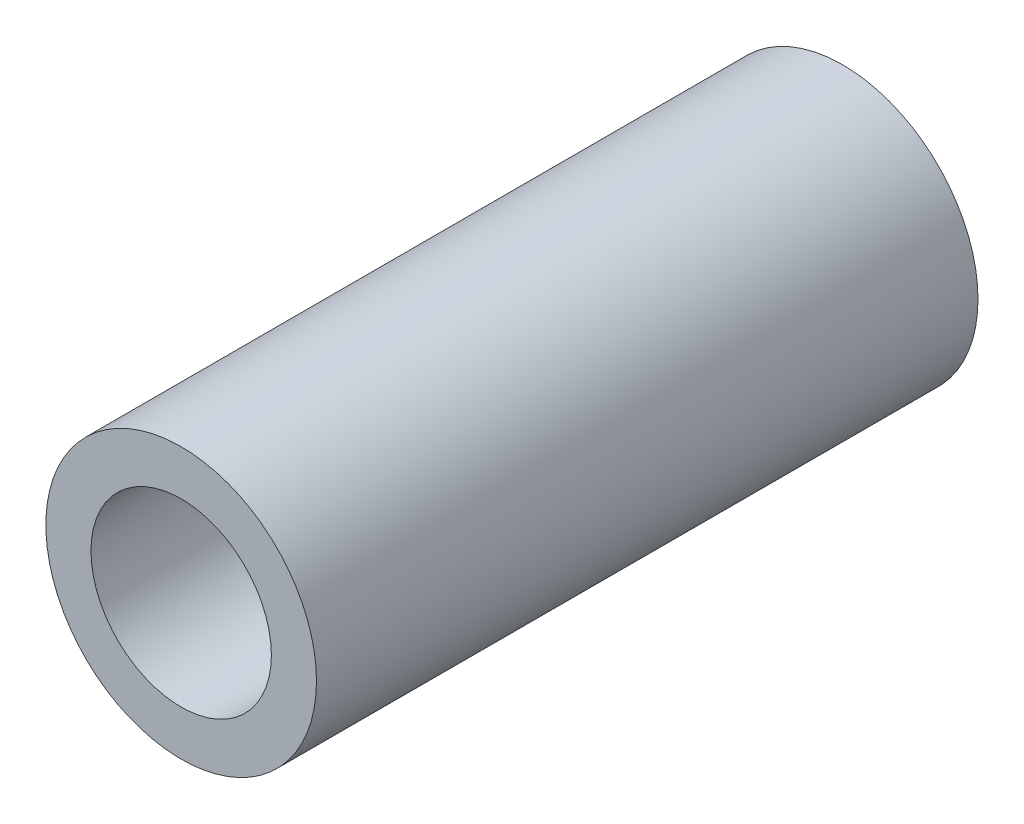
ISO-10303-21;
HEADER;
FILE_DESCRIPTION(('STEP AP214'),'2;1');
FILE_NAME('part.step','',(''),(''),'','','');
FILE_SCHEMA(('AUTOMOTIVE_DESIGN { 1 0 10303 214 1 1 1 1 }'));
ENDSEC;
DATA;
#1=APPLICATION_CONTEXT('core data for automotive mechanical design processes');
#2=APPLICATION_PROTOCOL_DEFINITION('international standard','automotive_design',2000,#1);
#3=PRODUCT_CONTEXT('',#1,'mechanical');
#4=PRODUCT('Part','Part','',(#3));
#5=PRODUCT_RELATED_PRODUCT_CATEGORY('part','',(#4));
#6=PRODUCT_DEFINITION_FORMATION('','',#4);
#7=PRODUCT_DEFINITION_CONTEXT('part definition',#1,'design');
#8=PRODUCT_DEFINITION('design','',#6,#7);
#9=PRODUCT_DEFINITION_SHAPE('','',#8);
#10=(LENGTH_UNIT() NAMED_UNIT(*) SI_UNIT(.MILLI.,.METRE.));
#11=(NAMED_UNIT(*) PLANE_ANGLE_UNIT() SI_UNIT($,.RADIAN.));
#12=(NAMED_UNIT(*) SI_UNIT($,.STERADIAN.) SOLID_ANGLE_UNIT());
#13=UNCERTAINTY_MEASURE_WITH_UNIT(LENGTH_MEASURE(1.E-05),#10,'distance_accuracy_value','');
#14=(GEOMETRIC_REPRESENTATION_CONTEXT(3) GLOBAL_UNCERTAINTY_ASSIGNED_CONTEXT((#13)) GLOBAL_UNIT_ASSIGNED_CONTEXT((#10,
#11,#12)) REPRESENTATION_CONTEXT('',''));
#15=CARTESIAN_POINT('',(0.,0.,0.));
#16=DIRECTION('',(0.,0.,1.));
#17=DIRECTION('',(1.,0.,0.));
#18=AXIS2_PLACEMENT_3D('',#15,#16,#17);
#19=CARTESIAN_POINT('',(0.,0.,22.));
#20=DIRECTION('',(0.,0.,1.));
#21=DIRECTION('',(1.,0.,0.));
#22=AXIS2_PLACEMENT_3D('',#19,#20,#21);
#23=PLANE('',#22);
#24=CARTESIAN_POINT('',(0.,0.,22.));
#25=DIRECTION('',(0.,0.,1.));
#26=DIRECTION('',(1.,0.,0.));
#27=AXIS2_PLACEMENT_3D('',#24,#25,#26);
#28=CIRCLE('',#27,4.5);
#29=CARTESIAN_POINT('',(4.5,0.,22.));
#30=VERTEX_POINT('',#29);
#31=EDGE_CURVE('E10',#30,#30,#28,.T.);
#32=ORIENTED_EDGE('',*,*,#31,.T.);
#33=EDGE_LOOP('',(#32));
#34=FACE_BOUND('',#33,.T.);
#35=CARTESIAN_POINT('',(0.,0.,22.));
#36=DIRECTION('',(0.,0.,1.));
#37=DIRECTION('',(1.,0.,0.));
#38=AXIS2_PLACEMENT_3D('',#35,#36,#37);
#39=CIRCLE('',#38,3.);
#40=CARTESIAN_POINT('',(3.,0.,22.));
#41=VERTEX_POINT('',#40);
#42=EDGE_CURVE('E56',#41,#41,#39,.T.);
#43=ORIENTED_EDGE('',*,*,#42,.F.);
#44=EDGE_LOOP('',(#43));
#45=FACE_BOUND('',#44,.T.);
#46=ADVANCED_FACE('F43',(#34,#45),#23,.T.);
#47=CARTESIAN_POINT('',(0.,0.,0.));
#48=DIRECTION('',(0.,0.,1.));
#49=DIRECTION('',(1.,0.,0.));
#50=AXIS2_PLACEMENT_3D('',#47,#48,#49);
#51=PLANE('',#50);
#52=CARTESIAN_POINT('',(0.,0.,0.));
#53=DIRECTION('',(0.,0.,1.));
#54=DIRECTION('',(1.,0.,0.));
#55=AXIS2_PLACEMENT_3D('',#52,#53,#54);
#56=CIRCLE('',#55,4.5);
#57=CARTESIAN_POINT('',(4.5,0.,0.));
#58=VERTEX_POINT('',#57);
#59=EDGE_CURVE('E47',#58,#58,#56,.T.);
#60=ORIENTED_EDGE('',*,*,#59,.F.);
#61=EDGE_LOOP('',(#60));
#62=FACE_BOUND('',#61,.T.);
#63=CARTESIAN_POINT('',(0.,0.,0.));
#64=DIRECTION('',(0.,0.,1.));
#65=DIRECTION('',(1.,0.,0.));
#66=AXIS2_PLACEMENT_3D('',#63,#64,#65);
#67=CIRCLE('',#66,3.);
#68=CARTESIAN_POINT('',(3.,0.,0.));
#69=VERTEX_POINT('',#68);
#70=EDGE_CURVE('E58',#69,#69,#67,.T.);
#71=ORIENTED_EDGE('',*,*,#70,.T.);
#72=EDGE_LOOP('',(#71));
#73=FACE_BOUND('',#72,.T.);
#74=ADVANCED_FACE('F70',(#62,#73),#51,.F.);
#75=CARTESIAN_POINT('',(0.,0.,22.));
#76=DIRECTION('',(0.,0.,-1.));
#77=DIRECTION('',(-1.,0.,0.));
#78=AXIS2_PLACEMENT_3D('',#75,#76,#77);
#79=CYLINDRICAL_SURFACE('',#78,4.5);
#80=ORIENTED_EDGE('',*,*,#31,.F.);
#81=EDGE_LOOP('',(#80));
#82=FACE_BOUND('',#81,.T.);
#83=ORIENTED_EDGE('',*,*,#59,.T.);
#84=EDGE_LOOP('',(#83));
#85=FACE_BOUND('',#84,.T.);
#86=ADVANCED_FACE('F45',(#82,#85),#79,.T.);
#87=CARTESIAN_POINT('',(0.,0.,22.));
#88=DIRECTION('',(0.,0.,-1.));
#89=DIRECTION('',(-1.,0.,0.));
#90=AXIS2_PLACEMENT_3D('',#87,#88,#89);
#91=CYLINDRICAL_SURFACE('',#90,3.);
#92=ORIENTED_EDGE('',*,*,#42,.T.);
#93=EDGE_LOOP('',(#92));
#94=FACE_BOUND('',#93,.T.);
#95=ORIENTED_EDGE('',*,*,#70,.F.);
#96=EDGE_LOOP('',(#95));
#97=FACE_BOUND('',#96,.T.);
#98=ADVANCED_FACE('F66',(#94,#97),#91,.F.);
#99=CLOSED_SHELL('',(#46,#74,#86,#98));
#100=MANIFOLD_SOLID_BREP('B2',#99);
#101=ADVANCED_BREP_SHAPE_REPRESENTATION('',(#18,#100),#14);
#102=SHAPE_DEFINITION_REPRESENTATION(#9,#101);
ENDSEC;
END-ISO-10303-21;
